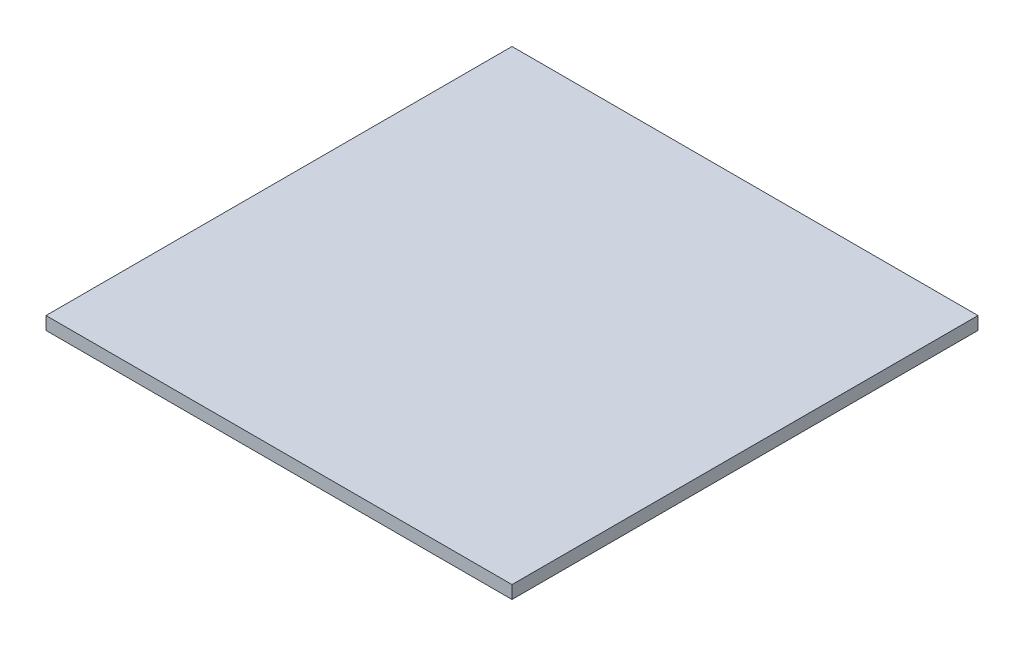
ISO-10303-21;
HEADER;
FILE_DESCRIPTION(('STEP AP214'),'2;1');
FILE_NAME('part.step','',(''),(''),'','','');
FILE_SCHEMA(('AUTOMOTIVE_DESIGN { 1 0 10303 214 1 1 1 1 }'));
ENDSEC;
DATA;
#1=APPLICATION_CONTEXT('core data for automotive mechanical design processes');
#2=APPLICATION_PROTOCOL_DEFINITION('international standard','automotive_design',2000,#1);
#3=PRODUCT_CONTEXT('',#1,'mechanical');
#4=PRODUCT('Part','Part','',(#3));
#5=PRODUCT_RELATED_PRODUCT_CATEGORY('part','',(#4));
#6=PRODUCT_DEFINITION_FORMATION('','',#4);
#7=PRODUCT_DEFINITION_CONTEXT('part definition',#1,'design');
#8=PRODUCT_DEFINITION('design','',#6,#7);
#9=PRODUCT_DEFINITION_SHAPE('','',#8);
#10=(LENGTH_UNIT() NAMED_UNIT(*) SI_UNIT(.MILLI.,.METRE.));
#11=(NAMED_UNIT(*) PLANE_ANGLE_UNIT() SI_UNIT($,.RADIAN.));
#12=(NAMED_UNIT(*) SI_UNIT($,.STERADIAN.) SOLID_ANGLE_UNIT());
#13=UNCERTAINTY_MEASURE_WITH_UNIT(LENGTH_MEASURE(1.E-05),#10,'distance_accuracy_value','');
#14=(GEOMETRIC_REPRESENTATION_CONTEXT(3) GLOBAL_UNCERTAINTY_ASSIGNED_CONTEXT((#13)) GLOBAL_UNIT_ASSIGNED_CONTEXT((#10,
#11,#12)) REPRESENTATION_CONTEXT('',''));
#15=CARTESIAN_POINT('',(0.,0.,0.));
#16=DIRECTION('',(0.,0.,1.));
#17=DIRECTION('',(1.,0.,0.));
#18=AXIS2_PLACEMENT_3D('',#15,#16,#17);
#19=CARTESIAN_POINT('',(54.,3.,54.));
#20=DIRECTION('',(-1.,0.,0.));
#21=DIRECTION('',(0.,0.,1.));
#22=AXIS2_PLACEMENT_3D('',#19,#20,#21);
#23=PLANE('',#22);
#24=DIRECTION('',(0.,0.,-1.));
#25=VECTOR('',#24,1.);
#26=CARTESIAN_POINT('',(54.,0.,54.));
#27=LINE('',#26,#25);
#28=CARTESIAN_POINT('',(54.,0.,54.));
#29=VERTEX_POINT('',#28);
#30=CARTESIAN_POINT('',(54.,0.,-54.));
#31=VERTEX_POINT('',#30);
#32=EDGE_CURVE('E97',#29,#31,#27,.T.);
#33=ORIENTED_EDGE('',*,*,#32,.T.);
#34=DIRECTION('',(0.,-1.,0.));
#35=VECTOR('',#34,1.);
#36=CARTESIAN_POINT('',(54.,3.,-54.));
#37=LINE('',#36,#35);
#38=CARTESIAN_POINT('',(54.,3.,-54.));
#39=VERTEX_POINT('',#38);
#40=EDGE_CURVE('E11',#39,#31,#37,.T.);
#41=ORIENTED_EDGE('',*,*,#40,.F.);
#42=DIRECTION('',(0.,0.,-1.));
#43=VECTOR('',#42,1.);
#44=CARTESIAN_POINT('',(54.,3.,54.));
#45=LINE('',#44,#43);
#46=CARTESIAN_POINT('',(54.,3.,54.));
#47=VERTEX_POINT('',#46);
#48=EDGE_CURVE('E85',#47,#39,#45,.T.);
#49=ORIENTED_EDGE('',*,*,#48,.F.);
#50=DIRECTION('',(0.,-1.,0.));
#51=VECTOR('',#50,1.);
#52=CARTESIAN_POINT('',(54.,3.,54.));
#53=LINE('',#52,#51);
#54=EDGE_CURVE('E93',#47,#29,#53,.T.);
#55=ORIENTED_EDGE('',*,*,#54,.T.);
#56=EDGE_LOOP('',(#33,#41,#49,#55));
#57=FACE_BOUND('',#56,.T.);
#58=ADVANCED_FACE('F34',(#57),#23,.F.);
#59=CARTESIAN_POINT('',(-54.,3.,-54.));
#60=DIRECTION('',(0.,0.,1.));
#61=DIRECTION('',(1.,0.,0.));
#62=AXIS2_PLACEMENT_3D('',#59,#60,#61);
#63=PLANE('',#62);
#64=DIRECTION('',(-1.,0.,0.));
#65=VECTOR('',#64,1.);
#66=CARTESIAN_POINT('',(-54.,0.,-54.));
#67=LINE('',#66,#65);
#68=CARTESIAN_POINT('',(-54.,0.,-54.));
#69=VERTEX_POINT('',#68);
#70=EDGE_CURVE('E89',#31,#69,#67,.T.);
#71=ORIENTED_EDGE('',*,*,#70,.T.);
#72=DIRECTION('',(0.,-1.,0.));
#73=VECTOR('',#72,1.);
#74=CARTESIAN_POINT('',(-54.,3.,-54.));
#75=LINE('',#74,#73);
#76=CARTESIAN_POINT('',(-54.,3.,-54.));
#77=VERTEX_POINT('',#76);
#78=EDGE_CURVE('E42',#77,#69,#75,.T.);
#79=ORIENTED_EDGE('',*,*,#78,.F.);
#80=DIRECTION('',(-1.,0.,0.));
#81=VECTOR('',#80,1.);
#82=CARTESIAN_POINT('',(-54.,3.,-54.));
#83=LINE('',#82,#81);
#84=EDGE_CURVE('E80',#39,#77,#83,.T.);
#85=ORIENTED_EDGE('',*,*,#84,.F.);
#86=ORIENTED_EDGE('',*,*,#40,.T.);
#87=EDGE_LOOP('',(#71,#79,#85,#86));
#88=FACE_BOUND('',#87,.T.);
#89=ADVANCED_FACE('F88',(#88),#63,.F.);
#90=CARTESIAN_POINT('',(-54.,3.,54.));
#91=DIRECTION('',(1.,0.,0.));
#92=DIRECTION('',(0.,0.,-1.));
#93=AXIS2_PLACEMENT_3D('',#90,#91,#92);
#94=PLANE('',#93);
#95=DIRECTION('',(0.,0.,1.));
#96=VECTOR('',#95,1.);
#97=CARTESIAN_POINT('',(-54.,0.,54.));
#98=LINE('',#97,#96);
#99=CARTESIAN_POINT('',(-54.,0.,54.));
#100=VERTEX_POINT('',#99);
#101=EDGE_CURVE('E67',#69,#100,#98,.T.);
#102=ORIENTED_EDGE('',*,*,#101,.T.);
#103=DIRECTION('',(0.,-1.,0.));
#104=VECTOR('',#103,1.);
#105=CARTESIAN_POINT('',(-54.,3.,54.));
#106=LINE('',#105,#104);
#107=CARTESIAN_POINT('',(-54.,3.,54.));
#108=VERTEX_POINT('',#107);
#109=EDGE_CURVE('E90',#108,#100,#106,.T.);
#110=ORIENTED_EDGE('',*,*,#109,.F.);
#111=DIRECTION('',(0.,0.,1.));
#112=VECTOR('',#111,1.);
#113=CARTESIAN_POINT('',(-54.,3.,54.));
#114=LINE('',#113,#112);
#115=EDGE_CURVE('E83',#77,#108,#114,.T.);
#116=ORIENTED_EDGE('',*,*,#115,.F.);
#117=ORIENTED_EDGE('',*,*,#78,.T.);
#118=EDGE_LOOP('',(#102,#110,#116,#117));
#119=FACE_BOUND('',#118,.T.);
#120=ADVANCED_FACE('F91',(#119),#94,.F.);
#121=CARTESIAN_POINT('',(-54.,3.,54.));
#122=DIRECTION('',(0.,0.,-1.));
#123=DIRECTION('',(-1.,0.,0.));
#124=AXIS2_PLACEMENT_3D('',#121,#122,#123);
#125=PLANE('',#124);
#126=DIRECTION('',(1.,0.,0.));
#127=VECTOR('',#126,1.);
#128=CARTESIAN_POINT('',(-54.,0.,54.));
#129=LINE('',#128,#127);
#130=EDGE_CURVE('E73',#100,#29,#129,.T.);
#131=ORIENTED_EDGE('',*,*,#130,.T.);
#132=ORIENTED_EDGE('',*,*,#54,.F.);
#133=DIRECTION('',(1.,0.,0.));
#134=VECTOR('',#133,1.);
#135=CARTESIAN_POINT('',(-54.,3.,54.));
#136=LINE('',#135,#134);
#137=EDGE_CURVE('E50',#108,#47,#136,.T.);
#138=ORIENTED_EDGE('',*,*,#137,.F.);
#139=ORIENTED_EDGE('',*,*,#109,.T.);
#140=EDGE_LOOP('',(#131,#132,#138,#139));
#141=FACE_BOUND('',#140,.T.);
#142=ADVANCED_FACE('F104',(#141),#125,.F.);
#143=CARTESIAN_POINT('',(0.,3.,0.));
#144=DIRECTION('',(0.,-1.,0.));
#145=DIRECTION('',(0.,0.,-1.));
#146=AXIS2_PLACEMENT_3D('',#143,#144,#145);
#147=PLANE('',#146);
#148=ORIENTED_EDGE('',*,*,#48,.T.);
#149=ORIENTED_EDGE('',*,*,#84,.T.);
#150=ORIENTED_EDGE('',*,*,#115,.T.);
#151=ORIENTED_EDGE('',*,*,#137,.T.);
#152=EDGE_LOOP('',(#148,#149,#150,#151));
#153=FACE_BOUND('',#152,.T.);
#154=ADVANCED_FACE('F81',(#153),#147,.F.);
#155=CARTESIAN_POINT('',(0.,0.,0.));
#156=DIRECTION('',(0.,-1.,0.));
#157=DIRECTION('',(0.,0.,-1.));
#158=AXIS2_PLACEMENT_3D('',#155,#156,#157);
#159=PLANE('',#158);
#160=ORIENTED_EDGE('',*,*,#32,.F.);
#161=ORIENTED_EDGE('',*,*,#130,.F.);
#162=ORIENTED_EDGE('',*,*,#101,.F.);
#163=ORIENTED_EDGE('',*,*,#70,.F.);
#164=EDGE_LOOP('',(#160,#161,#162,#163));
#165=FACE_BOUND('',#164,.T.);
#166=ADVANCED_FACE('F107',(#165),#159,.T.);
#167=CLOSED_SHELL('',(#58,#89,#120,#142,#154,#166));
#168=MANIFOLD_SOLID_BREP('B2',#167);
#169=ADVANCED_BREP_SHAPE_REPRESENTATION('',(#18,#168),#14);
#170=SHAPE_DEFINITION_REPRESENTATION(#9,#169);
ENDSEC;
END-ISO-10303-21;
